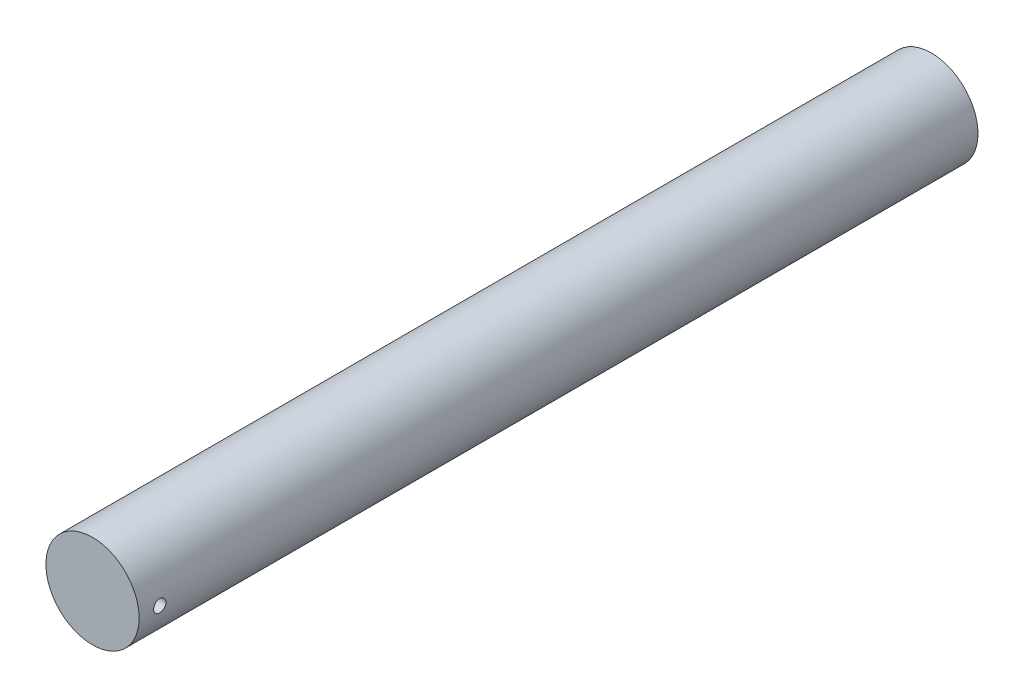
ISO-10303-21;
HEADER;
FILE_DESCRIPTION(('STEP AP214'),'2;1');
FILE_NAME('part.step','',(''),(''),'','','');
FILE_SCHEMA(('AUTOMOTIVE_DESIGN { 1 0 10303 214 1 1 1 1 }'));
ENDSEC;
DATA;
#1=APPLICATION_CONTEXT('core data for automotive mechanical design processes');
#2=APPLICATION_PROTOCOL_DEFINITION('international standard','automotive_design',2000,#1);
#3=PRODUCT_CONTEXT('',#1,'mechanical');
#4=PRODUCT('Part','Part','',(#3));
#5=PRODUCT_RELATED_PRODUCT_CATEGORY('part','',(#4));
#6=PRODUCT_DEFINITION_FORMATION('','',#4);
#7=PRODUCT_DEFINITION_CONTEXT('part definition',#1,'design');
#8=PRODUCT_DEFINITION('design','',#6,#7);
#9=PRODUCT_DEFINITION_SHAPE('','',#8);
#10=(LENGTH_UNIT() NAMED_UNIT(*) SI_UNIT(.MILLI.,.METRE.));
#11=(NAMED_UNIT(*) PLANE_ANGLE_UNIT() SI_UNIT($,.RADIAN.));
#12=(NAMED_UNIT(*) SI_UNIT($,.STERADIAN.) SOLID_ANGLE_UNIT());
#13=UNCERTAINTY_MEASURE_WITH_UNIT(LENGTH_MEASURE(1.E-05),#10,'distance_accuracy_value','');
#14=(GEOMETRIC_REPRESENTATION_CONTEXT(3) GLOBAL_UNCERTAINTY_ASSIGNED_CONTEXT((#13)) GLOBAL_UNIT_ASSIGNED_CONTEXT((#10,
#11,#12)) REPRESENTATION_CONTEXT('',''));
#15=CARTESIAN_POINT('',(0.,0.,0.));
#16=DIRECTION('',(0.,0.,1.));
#17=DIRECTION('',(1.,0.,0.));
#18=AXIS2_PLACEMENT_3D('',#15,#16,#17);
#19=CARTESIAN_POINT('',(0.,0.,51.435));
#20=DIRECTION('',(0.,0.,-1.));
#21=DIRECTION('',(-1.,0.,0.));
#22=AXIS2_PLACEMENT_3D('',#19,#20,#21);
#23=CYLINDRICAL_SURFACE('',#22,5.715);
#24=CARTESIAN_POINT('',(-4.90634932293515,-2.93069297629994,-5.715));
#25=CARTESIAN_POINT('',(-4.90634876751417,-2.9306956580515,-5.6377983761874));
#26=CARTESIAN_POINT('',(-4.9029619704678,-2.93638673992265,-5.56057103974399));
#27=CARTESIAN_POINT('',(-4.88942630856449,-2.95886828299997,-5.40833005576081));
#28=CARTESIAN_POINT('',(-4.87927333212493,-2.97566549298274,-5.33331778320337));
#29=CARTESIAN_POINT('',(-4.8522669454277,-3.01950121357936,-5.18773101979818));
#30=CARTESIAN_POINT('',(-4.83542193962212,-3.04652687637569,-5.11715109068624));
#31=CARTESIAN_POINT('',(-4.79510989272982,-3.10958850806805,-4.98219073630601));
#32=CARTESIAN_POINT('',(-4.77164264684828,-3.14562475561528,-4.91781050284782));
#33=CARTESIAN_POINT('',(-4.71770195871215,-3.2259715554173,-4.79572193875217));
#34=CARTESIAN_POINT('',(-4.68710408393251,-3.27042606922869,-4.73816329722004));
#35=CARTESIAN_POINT('',(-4.61939105503695,-3.36538949698687,-4.6326690772663));
#36=CARTESIAN_POINT('',(-4.58227531241657,-3.41589895750973,-4.58473436863707));
#37=CARTESIAN_POINT('',(-4.50140112531945,-3.52180404577538,-4.49924004635626));
#38=CARTESIAN_POINT('',(-4.45756089111084,-3.57725572943437,-4.46182691547253));
#39=CARTESIAN_POINT('',(-4.36432908055618,-3.6904232213349,-4.39938931551765));
#40=CARTESIAN_POINT('',(-4.31493828742677,-3.74813870939396,-4.37436310126598));
#41=CARTESIAN_POINT('',(-4.21269049328627,-3.86267266121795,-4.33788759032082));
#42=CARTESIAN_POINT('',(-4.15991935721091,-3.91948679752508,-4.32618424586016));
#43=CARTESIAN_POINT('',(-4.05146423128505,-4.03149298886801,-4.31588983503207));
#44=CARTESIAN_POINT('',(-3.99578065501198,-4.08668527248387,-4.31729691193544));
#45=CARTESIAN_POINT('',(-3.88437699072893,-4.192687771199,-4.33299947027936));
#46=CARTESIAN_POINT('',(-3.82868275452877,-4.24356612420478,-4.347020808044));
#47=CARTESIAN_POINT('',(-3.71785419852503,-4.34099443631514,-4.38711393284406));
#48=CARTESIAN_POINT('',(-3.66271990792579,-4.38754417068002,-4.41318634514605));
#49=CARTESIAN_POINT('',(-3.55434835516353,-4.4757975321448,-4.47686713222781));
#50=CARTESIAN_POINT('',(-3.50113185991086,-4.51745529730494,-4.51457424404795));
#51=CARTESIAN_POINT('',(-3.39893169418421,-4.59484534263122,-4.60037941975972));
#52=CARTESIAN_POINT('',(-3.34994873292195,-4.63057663089768,-4.64847921995394));
#53=CARTESIAN_POINT('',(-3.25678317498827,-4.69658777692163,-4.75517841252854));
#54=CARTESIAN_POINT('',(-3.21275775403123,-4.72670248565448,-4.81401746543528));
#55=CARTESIAN_POINT('',(-3.13279137037035,-4.78007963619672,-4.93975493428961));
#56=CARTESIAN_POINT('',(-3.09685075225921,-4.80334178594753,-5.00665369357369));
#57=CARTESIAN_POINT('',(-3.03450122141945,-4.84297476809366,-5.14704379194252));
#58=CARTESIAN_POINT('',(-3.00813554548871,-4.85931439494437,-5.22056320958482));
#59=CARTESIAN_POINT('',(-2.96646196627337,-4.88486769427543,-5.37184974544922));
#60=CARTESIAN_POINT('',(-2.95115181411619,-4.89408281602246,-5.44961599633283));
#61=CARTESIAN_POINT('',(-2.93263001610807,-4.90520345379328,-5.60508079883307));
#62=CARTESIAN_POINT('',(-2.92912214459884,-4.90728796404031,-5.68273130860972));
#63=CARTESIAN_POINT('',(-2.93355640585515,-4.90463846460039,-5.83758258011467));
#64=CARTESIAN_POINT('',(-2.94149753587662,-4.8999050520513,-5.91478338063553));
#65=CARTESIAN_POINT('',(-2.9682052216285,-4.88377081818079,-6.06531073378986));
#66=CARTESIAN_POINT('',(-2.98680227836861,-4.87247435398071,-6.13867876259684));
#67=CARTESIAN_POINT('',(-3.03380445699393,-4.84334751266318,-6.28083049313042));
#68=CARTESIAN_POINT('',(-3.0622107009581,-4.82551638802758,-6.34961366931854));
#69=CARTESIAN_POINT('',(-3.12820580756989,-4.78300294493676,-6.48207266963639));
#70=CARTESIAN_POINT('',(-3.16595762726444,-4.75819784922303,-6.54562781977872));
#71=CARTESIAN_POINT('',(-3.24879485943648,-4.70202680635919,-6.66453667678647));
#72=CARTESIAN_POINT('',(-3.29388142164698,-4.67065983040275,-6.71988909525654));
#73=CARTESIAN_POINT('',(-3.39081541494702,-4.60078718973317,-6.8221717572766));
#74=CARTESIAN_POINT('',(-3.44279823276059,-4.56212937109006,-6.86887015880001));
#75=CARTESIAN_POINT('',(-3.55069492395906,-4.47866448061528,-6.95084026974375));
#76=CARTESIAN_POINT('',(-3.60660859479148,-4.43385772551834,-6.98611256741397));
#77=CARTESIAN_POINT('',(-3.71993336485728,-4.33920805974812,-7.04392988483743));
#78=CARTESIAN_POINT('',(-3.7773307538188,-4.28940380673223,-7.06656487280428));
#79=CARTESIAN_POINT('',(-3.89201636190537,-4.18561919155826,-7.09873752127859));
#80=CARTESIAN_POINT('',(-3.94930459917621,-4.13163959957548,-7.10827759119338));
#81=CARTESIAN_POINT('',(-4.06044799739464,-4.02242486980854,-7.11385907203171));
#82=CARTESIAN_POINT('',(-4.11435363242051,-3.9672583473416,-7.11024333463093));
#83=CARTESIAN_POINT('',(-4.21879078946812,-3.85601488348183,-7.09039768944246));
#84=CARTESIAN_POINT('',(-4.2693224038429,-3.7999379670604,-7.07416812707178));
#85=CARTESIAN_POINT('',(-4.36557677836268,-3.68894821133165,-7.02973598982348));
#86=CARTESIAN_POINT('',(-4.41132205884723,-3.63403099028012,-7.00159295136106));
#87=CARTESIAN_POINT('',(-4.49744916075236,-3.52688343174455,-6.93418722815185));
#88=CARTESIAN_POINT('',(-4.53783033182072,-3.47465342053113,-6.89492319688443));
#89=CARTESIAN_POINT('',(-4.61354021733736,-3.3735083297912,-6.80533090521129));
#90=CARTESIAN_POINT('',(-4.64873095212376,-3.32469746393894,-6.75476838717954));
#91=CARTESIAN_POINT('',(-4.7125763374581,-3.23356647049105,-6.64447257703268));
#92=CARTESIAN_POINT('',(-4.74122934677422,-3.19124797361254,-6.58473698839107));
#93=CARTESIAN_POINT('',(-4.79224119865477,-3.11413387143339,-6.45652324864713));
#94=CARTESIAN_POINT('',(-4.8144801975023,-3.07948401310969,-6.38790955869566));
#95=CARTESIAN_POINT('',(-4.85184424992846,-3.02027595748519,-6.24468967981526));
#96=CARTESIAN_POINT('',(-4.86697464238371,-2.99571018834585,-6.17008803756727));
#97=CARTESIAN_POINT('',(-4.88778848799322,-2.96159771819065,-6.03214623239422));
#98=CARTESIAN_POINT('',(-4.89474607570274,-2.95004520025234,-5.96948424587705));
#99=CARTESIAN_POINT('',(-4.90402654399535,-2.93459201445352,-5.84288732183521));
#100=CARTESIAN_POINT('',(-4.90634978303624,-2.93069075478356,-5.77895248314956));
#101=CARTESIAN_POINT('',(-4.90634932293515,-2.93069297629994,-5.715));
#102=B_SPLINE_CURVE_WITH_KNOTS('',3,(#24,#25,#26,#27,#28,#29,#30,#31,#32,#33,#34,#35,#36,#37,
#38,#39,#40,#41,#42,#43,#44,#45,#46,#47,#48,#49,#50,#51,#52,#53,#54,#55,#56,#57,#58,#59,#60,#61,
#62,#63,#64,#65,#66,#67,#68,#69,#70,#71,#72,#73,#74,#75,#76,#77,#78,#79,#80,#81,#82,#83,#84,#85,
#86,#87,#88,#89,#90,#91,#92,#93,#94,#95,#96,#97,#98,#99,#100,#101),.UNSPECIFIED.,.T.,.F.,(4,2,2,
2,2,2,2,2,2,2,2,2,2,2,2,2,2,2,2,2,2,2,2,2,2,2,2,2,2,2,2,2,2,2,2,2,2,2,4),(0.,0.231370111333704,
0.462880946959771,0.694101944990476,0.925330094386131,1.16094350468642,1.39657819969315,
1.63534713617308,1.87408242314969,2.10818483591089,2.34225409503301,2.57135607652931,
2.80046994625148,3.03158429314698,3.2627372821283,3.49987675584789,3.73702633507719,
3.97523385357856,4.21339290315263,4.44552793107025,4.67764262901569,4.90616380432767,
5.13471112898195,5.3675653891342,5.60045618480857,5.83889063317635,6.077312804276,
6.31401520732017,6.55067405232248,6.78121005759198,7.01173975008569,7.24113074609693,
7.47054952846264,7.70525860096142,7.94002653020032,8.17893250901101,8.41765877093733,
8.60933657567442,8.8009995539338),.UNSPECIFIED.);
#103=CARTESIAN_POINT('',(-4.90634932293515,-2.93069297629994,-5.715));
#104=VERTEX_POINT('',#103);
#105=EDGE_CURVE('E41',#104,#104,#102,.T.);
#106=ORIENTED_EDGE('',*,*,#105,.T.);
#107=EDGE_LOOP('',(#106));
#108=FACE_BOUND('',#107,.T.);
#109=CARTESIAN_POINT('',(0.,0.,51.435));
#110=DIRECTION('',(0.,0.,1.));
#111=DIRECTION('',(1.,0.,0.));
#112=AXIS2_PLACEMENT_3D('',#109,#110,#111);
#113=CIRCLE('',#112,5.715);
#114=CARTESIAN_POINT('',(5.715,0.,51.435));
#115=VERTEX_POINT('',#114);
#116=EDGE_CURVE('E49',#115,#115,#113,.T.);
#117=ORIENTED_EDGE('',*,*,#116,.F.);
#118=EDGE_LOOP('',(#117));
#119=FACE_BOUND('',#118,.T.);
#120=CARTESIAN_POINT('',(0.,0.,-51.435));
#121=DIRECTION('',(0.,0.,1.));
#122=DIRECTION('',(1.,0.,0.));
#123=AXIS2_PLACEMENT_3D('',#120,#121,#122);
#124=CIRCLE('',#123,5.715);
#125=CARTESIAN_POINT('',(5.715,0.,-51.435));
#126=VERTEX_POINT('',#125);
#127=EDGE_CURVE('E53',#126,#126,#124,.T.);
#128=ORIENTED_EDGE('',*,*,#127,.T.);
#129=EDGE_LOOP('',(#128));
#130=FACE_BOUND('',#129,.T.);
#131=CARTESIAN_POINT('',(5.715,0.,49.657));
#132=CARTESIAN_POINT('',(5.71499937417909,-0.0425991663899972,49.6569982056017));
#133=CARTESIAN_POINT('',(5.71451868547061,-0.0852243581042624,49.6534157280363));
#134=CARTESIAN_POINT('',(5.71264736739351,-0.169286958277608,49.6391820210121));
#135=CARTESIAN_POINT('',(5.71125580800297,-0.210723107508886,49.6285235666442));
#136=CARTESIAN_POINT('',(5.70771939422494,-0.29117860711088,49.6004589456167));
#137=CARTESIAN_POINT('',(5.7055750666438,-0.330199625245285,49.5830574969944));
#138=CARTESIAN_POINT('',(5.70077112317609,-0.404760644006542,49.5420115658398));
#139=CARTESIAN_POINT('',(5.69811159038814,-0.440301204614403,49.5183680898756));
#140=CARTESIAN_POINT('',(5.69255527014976,-0.507120838374279,49.4653519473288));
#141=CARTESIAN_POINT('',(5.68965724459764,-0.538375092473921,49.4359481262518));
#142=CARTESIAN_POINT('',(5.68396045409579,-0.595521042914515,49.3723129179618));
#143=CARTESIAN_POINT('',(5.68116169440652,-0.62141245540941,49.3380812753816));
#144=CARTESIAN_POINT('',(5.67596820902712,-0.667191587644534,49.2655990341579));
#145=CARTESIAN_POINT('',(5.67357508068755,-0.687055804508618,49.2273334669756));
#146=CARTESIAN_POINT('',(5.66948035791487,-0.720066549477771,49.1479721633828));
#147=CARTESIAN_POINT('',(5.6677787337031,-0.733213366864505,49.1068765489334));
#148=CARTESIAN_POINT('',(5.66527163832663,-0.752340151801979,49.0232804861989));
#149=CARTESIAN_POINT('',(5.66446090386022,-0.758362228110605,48.980789833043));
#150=CARTESIAN_POINT('',(5.66381132263149,-0.763198932888323,48.8953938855701));
#151=CARTESIAN_POINT('',(5.66397243157173,-0.762013889864016,48.852488610241));
#152=CARTESIAN_POINT('',(5.66524351749509,-0.752504512028478,48.7677760494593));
#153=CARTESIAN_POINT('',(5.66634730821113,-0.744226721596007,48.7259634331135));
#154=CARTESIAN_POINT('',(5.66936973607178,-0.720839520856951,48.6443260651944));
#155=CARTESIAN_POINT('',(5.67128839179523,-0.705729954786149,48.6045013589683));
#156=CARTESIAN_POINT('',(5.67573132483301,-0.669058590035556,48.5278266291766));
#157=CARTESIAN_POINT('',(5.67825748061205,-0.647476726051382,48.490986315575));
#158=CARTESIAN_POINT('',(5.68362935999795,-0.598487728641738,48.4214325897894));
#159=CARTESIAN_POINT('',(5.68647510021805,-0.571080292314081,48.3887193923369));
#160=CARTESIAN_POINT('',(5.69219295607996,-0.510960967000434,48.3280784722063));
#161=CARTESIAN_POINT('',(5.69506510289196,-0.478208990377068,48.3001904799304));
#162=CARTESIAN_POINT('',(5.70049122974758,-0.408467878820822,48.2503015008823));
#163=CARTESIAN_POINT('',(5.70304520887466,-0.371478731682538,48.2283005310685));
#164=CARTESIAN_POINT('',(5.70754914016304,-0.294281435717306,48.1908094661583));
#165=CARTESIAN_POINT('',(5.70949884466612,-0.254071975538506,48.1753220396714));
#166=CARTESIAN_POINT('',(5.71257236669451,-0.171591322172109,48.1513301694715));
#167=CARTESIAN_POINT('',(5.71369622824863,-0.129320239025598,48.1428253534864));
#168=CARTESIAN_POINT('',(5.71498567964582,-0.0442595901670691,48.1330920371142));
#169=CARTESIAN_POINT('',(5.71515847256486,-0.00147638816242228,48.1318088409205));
#170=CARTESIAN_POINT('',(5.71454581576175,0.0836948861603318,48.1364105840325));
#171=CARTESIAN_POINT('',(5.71376038932936,0.126082968056698,48.1422953491191));
#172=CARTESIAN_POINT('',(5.71132401811436,0.209098025633289,48.1610205129393));
#173=CARTESIAN_POINT('',(5.70967634149413,0.249731028291089,48.1738346535307));
#174=CARTESIAN_POINT('',(5.70569982525884,0.328271542640346,48.206027400022));
#175=CARTESIAN_POINT('',(5.70337095965427,0.366178950272957,48.2254062563911));
#176=CARTESIAN_POINT('',(5.69827348037998,0.438435322752725,48.2703094112773));
#177=CARTESIAN_POINT('',(5.69550238232418,0.472762255285105,48.2958688763368));
#178=CARTESIAN_POINT('',(5.68983772638503,0.536658672803912,48.3523582084344));
#179=CARTESIAN_POINT('',(5.68694416294676,0.56622794169366,48.3832883192788));
#180=CARTESIAN_POINT('',(5.68133827842407,0.619965293302001,48.4498827073457));
#181=CARTESIAN_POINT('',(5.67862725883389,0.644096988190052,48.4855764729272));
#182=CARTESIAN_POINT('',(5.67371534673692,0.686022317610278,48.560542735317));
#183=CARTESIAN_POINT('',(5.67151444283915,0.703816093674418,48.5998151521859));
#184=CARTESIAN_POINT('',(5.6678810128821,0.73250235706784,48.6807093092126));
#185=CARTESIAN_POINT('',(5.6664462524262,0.743414929906288,48.7223238220653));
#186=CARTESIAN_POINT('',(5.66450130254049,0.758093481818478,48.8068151238411));
#187=CARTESIAN_POINT('',(5.66399106365641,0.761859843156034,48.8496918451216));
#188=CARTESIAN_POINT('',(5.66395450123566,0.762131390921577,48.9351282500152));
#189=CARTESIAN_POINT('',(5.6644204298964,0.758693755131012,48.9776877598074));
#190=CARTESIAN_POINT('',(5.6662669905607,0.744776425176281,49.0616181104146));
#191=CARTESIAN_POINT('',(5.66764762222145,0.73429673365125,49.1029889516751));
#192=CARTESIAN_POINT('',(5.67116553193923,0.706611402365707,49.1833574433188));
#193=CARTESIAN_POINT('',(5.67330245573231,0.689408911320544,49.2223561948355));
#194=CARTESIAN_POINT('',(5.67809270416585,0.648771915914596,49.2969229517377));
#195=CARTESIAN_POINT('',(5.68074603877705,0.625337291221931,49.332490890862));
#196=CARTESIAN_POINT('',(5.68629533496746,0.572690428821223,49.3994781566227));
#197=CARTESIAN_POINT('',(5.68919298692305,0.543435643734487,49.4308639070947));
#198=CARTESIAN_POINT('',(5.69488974939634,0.480068265222821,49.4883020454338));
#199=CARTESIAN_POINT('',(5.6976888366378,0.445954533818038,49.5143531804238));
#200=CARTESIAN_POINT('',(5.70288661987398,0.37366688837192,49.5604801797557));
#201=CARTESIAN_POINT('',(5.70528353388645,0.335476070503447,49.5805297439575));
#202=CARTESIAN_POINT('',(5.70938909171068,0.25625770805277,49.6139015080457));
#203=CARTESIAN_POINT('',(5.71109847208163,0.215233254687526,49.6272309111861));
#204=CARTESIAN_POINT('',(5.71323109984184,0.145004183485496,49.6436451904327));
#205=CARTESIAN_POINT('',(5.71389115144963,0.11623970222515,49.6486459057825));
#206=CARTESIAN_POINT('',(5.71477581384984,0.0583208783857373,49.655323910197));
#207=CARTESIAN_POINT('',(5.71500042848327,0.0291665392479219,49.6570012285778));
#208=CARTESIAN_POINT('',(5.715,0.,49.657));
#209=B_SPLINE_CURVE_WITH_KNOTS('',3,(#131,#132,#133,#134,#135,#136,#137,#138,#139,#140,#141,
#142,#143,#144,#145,#146,#147,#148,#149,#150,#151,#152,#153,#154,#155,#156,#157,#158,#159,#160,
#161,#162,#163,#164,#165,#166,#167,#168,#169,#170,#171,#172,#173,#174,#175,#176,#177,#178,#179,
#180,#181,#182,#183,#184,#185,#186,#187,#188,#189,#190,#191,#192,#193,#194,#195,#196,#197,#198,
#199,#200,#201,#202,#203,#204,#205,#206,#207,#208),.UNSPECIFIED.,.T.,.F.,(4,2,2,2,2,2,2,2,2,2,2,
2,2,2,2,2,2,2,2,2,2,2,2,2,2,2,2,2,2,2,2,2,2,2,2,2,2,2,4),(0.,0.127690950347488,
0.255512480167201,0.383244734967239,0.51095640466897,0.639378877869958,0.76780814651742,
0.896731968959378,1.02565023888923,1.1538027060337,1.28194933192395,1.40926141222354,
1.53657639537998,1.66429023175538,1.79201071027086,1.92073737448727,2.04946440951724,
2.17824413297166,2.30701699019253,2.43481320881974,2.56260632139055,2.68991853454051,
2.8172356056885,2.94529487687325,3.07335996296586,3.20225815428005,3.3311534669903,
3.45967078474207,3.58818122767563,3.71567555376212,3.84316983206789,3.97060446810696,
4.09804156487037,4.22644697445174,4.3548825065669,4.48387289662988,4.61272472802109,
4.70015216577022,4.78757883231149),.UNSPECIFIED.);
#210=CARTESIAN_POINT('',(5.715,0.,49.657));
#211=VERTEX_POINT('',#210);
#212=EDGE_CURVE('E10',#211,#211,#209,.T.);
#213=ORIENTED_EDGE('',*,*,#212,.F.);
#214=EDGE_LOOP('',(#213));
#215=FACE_BOUND('',#214,.T.);
#216=ADVANCED_FACE('F37',(#108,#119,#130,#215),#23,.T.);
#217=CARTESIAN_POINT('',(0.,0.,51.435));
#218=DIRECTION('',(0.,0.,1.));
#219=DIRECTION('',(1.,0.,0.));
#220=AXIS2_PLACEMENT_3D('',#217,#218,#219);
#221=PLANE('',#220);
#222=ORIENTED_EDGE('',*,*,#116,.T.);
#223=EDGE_LOOP('',(#222));
#224=FACE_BOUND('',#223,.T.);
#225=ADVANCED_FACE('F68',(#224),#221,.T.);
#226=CARTESIAN_POINT('',(0.,0.,-51.435));
#227=DIRECTION('',(0.,0.,1.));
#228=DIRECTION('',(1.,0.,0.));
#229=AXIS2_PLACEMENT_3D('',#226,#227,#228);
#230=PLANE('',#229);
#231=ORIENTED_EDGE('',*,*,#127,.F.);
#232=EDGE_LOOP('',(#231));
#233=FACE_BOUND('',#232,.T.);
#234=ADVANCED_FACE('F66',(#233),#230,.F.);
#235=CARTESIAN_POINT('',(5.715,0.,48.895));
#236=DIRECTION('',(-1.,0.,0.));
#237=DIRECTION('',(0.,0.,1.));
#238=AXIS2_PLACEMENT_3D('',#235,#236,#237);
#239=CYLINDRICAL_SURFACE('',#238,0.761999999999996);
#240=CARTESIAN_POINT('',(0.,0.,48.895));
#241=DIRECTION('',(1.,0.,0.));
#242=DIRECTION('',(0.,0.,-1.));
#243=AXIS2_PLACEMENT_3D('',#240,#241,#242);
#244=CIRCLE('',#243,0.761999999999996);
#245=CARTESIAN_POINT('',(0.,0.,48.133));
#246=VERTEX_POINT('',#245);
#247=EDGE_CURVE('E87',#246,#246,#244,.T.);
#248=ORIENTED_EDGE('',*,*,#247,.F.);
#249=EDGE_LOOP('',(#248));
#250=FACE_BOUND('',#249,.T.);
#251=ORIENTED_EDGE('',*,*,#212,.T.);
#252=EDGE_LOOP('',(#251));
#253=FACE_BOUND('',#252,.T.);
#254=ADVANCED_FACE('F60',(#250,#253),#239,.F.);
#255=CARTESIAN_POINT('',(0.,0.,48.895));
#256=DIRECTION('',(1.,0.,0.));
#257=DIRECTION('',(0.,0.,-1.));
#258=AXIS2_PLACEMENT_3D('',#255,#256,#257);
#259=PLANE('',#258);
#260=ORIENTED_EDGE('',*,*,#247,.T.);
#261=EDGE_LOOP('',(#260));
#262=FACE_BOUND('',#261,.T.);
#263=ADVANCED_FACE('F65',(#262),#259,.T.);
#264=CARTESIAN_POINT('',(-5.715,-5.715,-5.715));
#265=DIRECTION('',(0.707106781186547,0.707106781186547,0.));
#266=DIRECTION('',(-0.707106781186548,0.707106781186548,0.));
#267=AXIS2_PLACEMENT_3D('',#264,#265,#266);
#268=CYLINDRICAL_SURFACE('',#267,1.397);
#269=CARTESIAN_POINT('',(0.,0.,-5.715));
#270=DIRECTION('',(0.707106781186548,0.707106781186548,0.));
#271=DIRECTION('',(-0.707106781186548,0.707106781186548,0.));
#272=AXIS2_PLACEMENT_3D('',#269,#270,#271);
#273=CIRCLE('',#272,1.397);
#274=CARTESIAN_POINT('',(-0.987828173317607,0.987828173317607,-5.715));
#275=VERTEX_POINT('',#274);
#276=EDGE_CURVE('E92',#275,#275,#273,.T.);
#277=ORIENTED_EDGE('',*,*,#276,.T.);
#278=EDGE_LOOP('',(#277));
#279=FACE_BOUND('',#278,.T.);
#280=ORIENTED_EDGE('',*,*,#105,.F.);
#281=EDGE_LOOP('',(#280));
#282=FACE_BOUND('',#281,.T.);
#283=ADVANCED_FACE('F97',(#279,#282),#268,.F.);
#284=CARTESIAN_POINT('',(0.,0.,-5.715));
#285=DIRECTION('',(0.707106781186548,0.707106781186548,0.));
#286=DIRECTION('',(-0.707106781186548,0.707106781186548,0.));
#287=AXIS2_PLACEMENT_3D('',#284,#285,#286);
#288=PLANE('',#287);
#289=ORIENTED_EDGE('',*,*,#276,.F.);
#290=EDGE_LOOP('',(#289));
#291=FACE_BOUND('',#290,.T.);
#292=ADVANCED_FACE('F100',(#291),#288,.F.);
#293=CLOSED_SHELL('',(#216,#225,#234,#254,#263,#283,#292));
#294=MANIFOLD_SOLID_BREP('B2',#293);
#295=ADVANCED_BREP_SHAPE_REPRESENTATION('',(#18,#294),#14);
#296=SHAPE_DEFINITION_REPRESENTATION(#9,#295);
ENDSEC;
END-ISO-10303-21;
